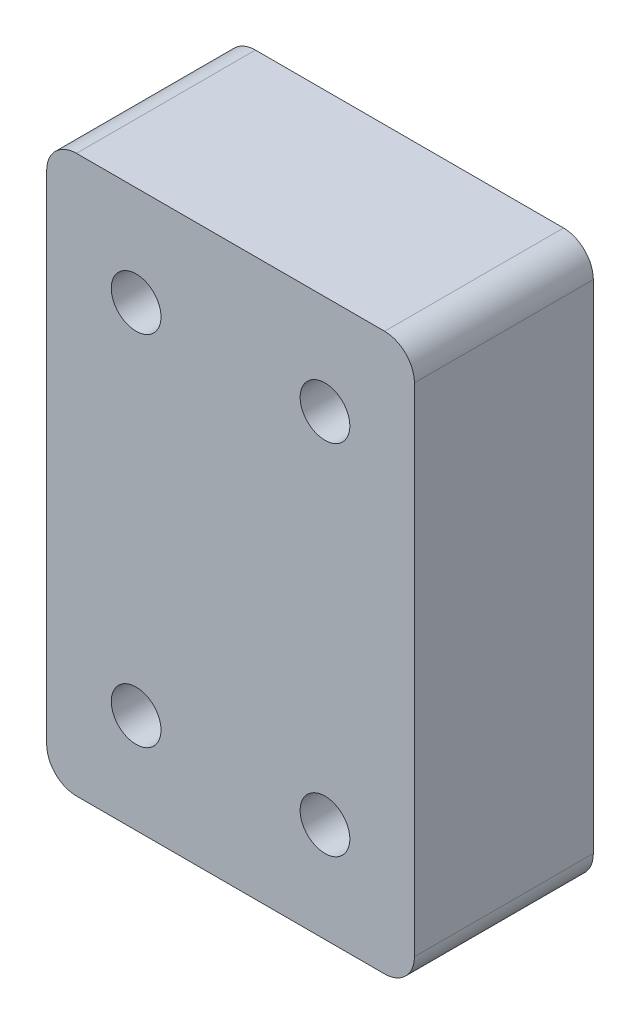
ISO-10303-21;
HEADER;
FILE_DESCRIPTION(('STEP AP214'),'2;1');
FILE_NAME('part.step','',(''),(''),'','','');
FILE_SCHEMA(('AUTOMOTIVE_DESIGN { 1 0 10303 214 1 1 1 1 }'));
ENDSEC;
DATA;
#1=APPLICATION_CONTEXT('core data for automotive mechanical design processes');
#2=APPLICATION_PROTOCOL_DEFINITION('international standard','automotive_design',2000,#1);
#3=PRODUCT_CONTEXT('',#1,'mechanical');
#4=PRODUCT('Part','Part','',(#3));
#5=PRODUCT_RELATED_PRODUCT_CATEGORY('part','',(#4));
#6=PRODUCT_DEFINITION_FORMATION('','',#4);
#7=PRODUCT_DEFINITION_CONTEXT('part definition',#1,'design');
#8=PRODUCT_DEFINITION('design','',#6,#7);
#9=PRODUCT_DEFINITION_SHAPE('','',#8);
#10=(LENGTH_UNIT() NAMED_UNIT(*) SI_UNIT(.MILLI.,.METRE.));
#11=(NAMED_UNIT(*) PLANE_ANGLE_UNIT() SI_UNIT($,.RADIAN.));
#12=(NAMED_UNIT(*) SI_UNIT($,.STERADIAN.) SOLID_ANGLE_UNIT());
#13=UNCERTAINTY_MEASURE_WITH_UNIT(LENGTH_MEASURE(1.E-05),#10,'distance_accuracy_value','');
#14=(GEOMETRIC_REPRESENTATION_CONTEXT(3) GLOBAL_UNCERTAINTY_ASSIGNED_CONTEXT((#13)) GLOBAL_UNIT_ASSIGNED_CONTEXT((#10,
#11,#12)) REPRESENTATION_CONTEXT('',''));
#15=CARTESIAN_POINT('',(0.,0.,0.));
#16=DIRECTION('',(0.,0.,1.));
#17=DIRECTION('',(1.,0.,0.));
#18=AXIS2_PLACEMENT_3D('',#15,#16,#17);
#19=CARTESIAN_POINT('',(-15.5,-25.,18.));
#20=DIRECTION('',(0.,0.,-1.));
#21=DIRECTION('',(-1.,0.,0.));
#22=AXIS2_PLACEMENT_3D('',#19,#20,#21);
#23=CYLINDRICAL_SURFACE('',#22,3.);
#24=CARTESIAN_POINT('',(-15.5,-25.,0.));
#25=DIRECTION('',(0.,0.,1.));
#26=DIRECTION('',(-1.,0.,0.));
#27=AXIS2_PLACEMENT_3D('',#24,#25,#26);
#28=CIRCLE('',#27,3.);
#29=CARTESIAN_POINT('',(-18.5,-25.,0.));
#30=VERTEX_POINT('',#29);
#31=CARTESIAN_POINT('',(-15.5,-28.,0.));
#32=VERTEX_POINT('',#31);
#33=EDGE_CURVE('E140',#30,#32,#28,.T.);
#34=ORIENTED_EDGE('',*,*,#33,.T.);
#35=DIRECTION('',(0.,0.,-1.));
#36=VECTOR('',#35,1.);
#37=CARTESIAN_POINT('',(-15.5,-28.,18.));
#38=LINE('',#37,#36);
#39=CARTESIAN_POINT('',(-15.5,-28.,18.));
#40=VERTEX_POINT('',#39);
#41=EDGE_CURVE('E11',#40,#32,#38,.T.);
#42=ORIENTED_EDGE('',*,*,#41,.F.);
#43=CARTESIAN_POINT('',(-15.5,-25.,18.));
#44=DIRECTION('',(0.,0.,1.));
#45=DIRECTION('',(-1.,0.,0.));
#46=AXIS2_PLACEMENT_3D('',#43,#44,#45);
#47=CIRCLE('',#46,3.);
#48=CARTESIAN_POINT('',(-18.5,-25.,18.));
#49=VERTEX_POINT('',#48);
#50=EDGE_CURVE('E163',#49,#40,#47,.T.);
#51=ORIENTED_EDGE('',*,*,#50,.F.);
#52=DIRECTION('',(0.,0.,-1.));
#53=VECTOR('',#52,1.);
#54=CARTESIAN_POINT('',(-18.5,-25.,18.));
#55=LINE('',#54,#53);
#56=EDGE_CURVE('E136',#49,#30,#55,.T.);
#57=ORIENTED_EDGE('',*,*,#56,.T.);
#58=EDGE_LOOP('',(#34,#42,#51,#57));
#59=FACE_BOUND('',#58,.T.);
#60=ADVANCED_FACE('F39',(#59),#23,.T.);
#61=CARTESIAN_POINT('',(-15.5,-28.,18.));
#62=DIRECTION('',(0.,1.,0.));
#63=DIRECTION('',(0.,0.,1.));
#64=AXIS2_PLACEMENT_3D('',#61,#62,#63);
#65=PLANE('',#64);
#66=DIRECTION('',(1.,0.,0.));
#67=VECTOR('',#66,1.);
#68=CARTESIAN_POINT('',(-15.5,-28.,0.));
#69=LINE('',#68,#67);
#70=CARTESIAN_POINT('',(15.5,-28.,0.));
#71=VERTEX_POINT('',#70);
#72=EDGE_CURVE('E144',#32,#71,#69,.T.);
#73=ORIENTED_EDGE('',*,*,#72,.T.);
#74=DIRECTION('',(0.,0.,-1.));
#75=VECTOR('',#74,1.);
#76=CARTESIAN_POINT('',(15.5,-28.,18.));
#77=LINE('',#76,#75);
#78=CARTESIAN_POINT('',(15.5,-28.,18.));
#79=VERTEX_POINT('',#78);
#80=EDGE_CURVE('E48',#79,#71,#77,.T.);
#81=ORIENTED_EDGE('',*,*,#80,.F.);
#82=DIRECTION('',(1.,0.,0.));
#83=VECTOR('',#82,1.);
#84=CARTESIAN_POINT('',(-15.5,-28.,18.));
#85=LINE('',#84,#83);
#86=EDGE_CURVE('E99',#40,#79,#85,.T.);
#87=ORIENTED_EDGE('',*,*,#86,.F.);
#88=ORIENTED_EDGE('',*,*,#41,.T.);
#89=EDGE_LOOP('',(#73,#81,#87,#88));
#90=FACE_BOUND('',#89,.T.);
#91=ADVANCED_FACE('F268',(#90),#65,.F.);
#92=CARTESIAN_POINT('',(15.5,-25.,18.));
#93=DIRECTION('',(0.,0.,-1.));
#94=DIRECTION('',(-1.,0.,0.));
#95=AXIS2_PLACEMENT_3D('',#92,#93,#94);
#96=CYLINDRICAL_SURFACE('',#95,3.);
#97=CARTESIAN_POINT('',(15.5,-25.,0.));
#98=DIRECTION('',(0.,0.,1.));
#99=DIRECTION('',(1.,0.,0.));
#100=AXIS2_PLACEMENT_3D('',#97,#98,#99);
#101=CIRCLE('',#100,3.);
#102=CARTESIAN_POINT('',(18.5,-25.,0.));
#103=VERTEX_POINT('',#102);
#104=EDGE_CURVE('E148',#71,#103,#101,.T.);
#105=ORIENTED_EDGE('',*,*,#104,.T.);
#106=DIRECTION('',(0.,0.,-1.));
#107=VECTOR('',#106,1.);
#108=CARTESIAN_POINT('',(18.5,-25.,18.));
#109=LINE('',#108,#107);
#110=CARTESIAN_POINT('',(18.5,-25.,18.));
#111=VERTEX_POINT('',#110);
#112=EDGE_CURVE('E174',#111,#103,#109,.T.);
#113=ORIENTED_EDGE('',*,*,#112,.F.);
#114=CARTESIAN_POINT('',(15.5,-25.,18.));
#115=DIRECTION('',(0.,0.,1.));
#116=DIRECTION('',(1.,0.,0.));
#117=AXIS2_PLACEMENT_3D('',#114,#115,#116);
#118=CIRCLE('',#117,3.);
#119=EDGE_CURVE('E184',#79,#111,#118,.T.);
#120=ORIENTED_EDGE('',*,*,#119,.F.);
#121=ORIENTED_EDGE('',*,*,#80,.T.);
#122=EDGE_LOOP('',(#105,#113,#120,#121));
#123=FACE_BOUND('',#122,.T.);
#124=ADVANCED_FACE('F182',(#123),#96,.T.);
#125=CARTESIAN_POINT('',(18.5,-25.,18.));
#126=DIRECTION('',(-1.,0.,0.));
#127=DIRECTION('',(0.,0.,1.));
#128=AXIS2_PLACEMENT_3D('',#125,#126,#127);
#129=PLANE('',#128);
#130=DIRECTION('',(0.,1.,0.));
#131=VECTOR('',#130,1.);
#132=CARTESIAN_POINT('',(18.5,-25.,0.));
#133=LINE('',#132,#131);
#134=CARTESIAN_POINT('',(18.5,25.,0.));
#135=VERTEX_POINT('',#134);
#136=EDGE_CURVE('E151',#103,#135,#133,.T.);
#137=ORIENTED_EDGE('',*,*,#136,.T.);
#138=DIRECTION('',(0.,0.,-1.));
#139=VECTOR('',#138,1.);
#140=CARTESIAN_POINT('',(18.5,25.,18.));
#141=LINE('',#140,#139);
#142=CARTESIAN_POINT('',(18.5,25.,18.));
#143=VERTEX_POINT('',#142);
#144=EDGE_CURVE('E170',#143,#135,#141,.T.);
#145=ORIENTED_EDGE('',*,*,#144,.F.);
#146=DIRECTION('',(0.,1.,0.));
#147=VECTOR('',#146,1.);
#148=CARTESIAN_POINT('',(18.5,-25.,18.));
#149=LINE('',#148,#147);
#150=EDGE_CURVE('E197',#111,#143,#149,.T.);
#151=ORIENTED_EDGE('',*,*,#150,.F.);
#152=ORIENTED_EDGE('',*,*,#112,.T.);
#153=EDGE_LOOP('',(#137,#145,#151,#152));
#154=FACE_BOUND('',#153,.T.);
#155=ADVANCED_FACE('F192',(#154),#129,.F.);
#156=CARTESIAN_POINT('',(15.5,25.,18.));
#157=DIRECTION('',(0.,0.,-1.));
#158=DIRECTION('',(-1.,0.,0.));
#159=AXIS2_PLACEMENT_3D('',#156,#157,#158);
#160=CYLINDRICAL_SURFACE('',#159,3.);
#161=CARTESIAN_POINT('',(15.5,25.,0.));
#162=DIRECTION('',(0.,0.,1.));
#163=DIRECTION('',(-1.,0.,0.));
#164=AXIS2_PLACEMENT_3D('',#161,#162,#163);
#165=CIRCLE('',#164,3.);
#166=CARTESIAN_POINT('',(15.5,28.,0.));
#167=VERTEX_POINT('',#166);
#168=EDGE_CURVE('E154',#135,#167,#165,.T.);
#169=ORIENTED_EDGE('',*,*,#168,.T.);
#170=DIRECTION('',(0.,0.,-1.));
#171=VECTOR('',#170,1.);
#172=CARTESIAN_POINT('',(15.5,28.,18.));
#173=LINE('',#172,#171);
#174=CARTESIAN_POINT('',(15.5,28.,18.));
#175=VERTEX_POINT('',#174);
#176=EDGE_CURVE('E129',#175,#167,#173,.T.);
#177=ORIENTED_EDGE('',*,*,#176,.F.);
#178=CARTESIAN_POINT('',(15.5,25.,18.));
#179=DIRECTION('',(0.,0.,1.));
#180=DIRECTION('',(-1.,0.,0.));
#181=AXIS2_PLACEMENT_3D('',#178,#179,#180);
#182=CIRCLE('',#181,3.);
#183=EDGE_CURVE('E118',#143,#175,#182,.T.);
#184=ORIENTED_EDGE('',*,*,#183,.F.);
#185=ORIENTED_EDGE('',*,*,#144,.T.);
#186=EDGE_LOOP('',(#169,#177,#184,#185));
#187=FACE_BOUND('',#186,.T.);
#188=ADVANCED_FACE('F195',(#187),#160,.T.);
#189=CARTESIAN_POINT('',(-15.5,28.,18.));
#190=DIRECTION('',(0.,-1.,0.));
#191=DIRECTION('',(0.,0.,-1.));
#192=AXIS2_PLACEMENT_3D('',#189,#190,#191);
#193=PLANE('',#192);
#194=DIRECTION('',(-1.,0.,0.));
#195=VECTOR('',#194,1.);
#196=CARTESIAN_POINT('',(-15.5,28.,0.));
#197=LINE('',#196,#195);
#198=CARTESIAN_POINT('',(-15.5,28.,0.));
#199=VERTEX_POINT('',#198);
#200=EDGE_CURVE('E127',#167,#199,#197,.T.);
#201=ORIENTED_EDGE('',*,*,#200,.T.);
#202=DIRECTION('',(0.,0.,-1.));
#203=VECTOR('',#202,1.);
#204=CARTESIAN_POINT('',(-15.5,28.,18.));
#205=LINE('',#204,#203);
#206=CARTESIAN_POINT('',(-15.5,28.,18.));
#207=VERTEX_POINT('',#206);
#208=EDGE_CURVE('E124',#207,#199,#205,.T.);
#209=ORIENTED_EDGE('',*,*,#208,.F.);
#210=DIRECTION('',(-1.,0.,0.));
#211=VECTOR('',#210,1.);
#212=CARTESIAN_POINT('',(-15.5,28.,18.));
#213=LINE('',#212,#211);
#214=EDGE_CURVE('E112',#175,#207,#213,.T.);
#215=ORIENTED_EDGE('',*,*,#214,.F.);
#216=ORIENTED_EDGE('',*,*,#176,.T.);
#217=EDGE_LOOP('',(#201,#209,#215,#216));
#218=FACE_BOUND('',#217,.T.);
#219=ADVANCED_FACE('F125',(#218),#193,.F.);
#220=CARTESIAN_POINT('',(-15.5,25.,18.));
#221=DIRECTION('',(0.,0.,-1.));
#222=DIRECTION('',(-1.,0.,0.));
#223=AXIS2_PLACEMENT_3D('',#220,#221,#222);
#224=CYLINDRICAL_SURFACE('',#223,3.);
#225=CARTESIAN_POINT('',(-15.5,25.,0.));
#226=DIRECTION('',(0.,0.,1.));
#227=DIRECTION('',(-1.,0.,0.));
#228=AXIS2_PLACEMENT_3D('',#225,#226,#227);
#229=CIRCLE('',#228,3.);
#230=CARTESIAN_POINT('',(-18.5,25.,0.));
#231=VERTEX_POINT('',#230);
#232=EDGE_CURVE('E85',#199,#231,#229,.T.);
#233=ORIENTED_EDGE('',*,*,#232,.T.);
#234=DIRECTION('',(0.,0.,-1.));
#235=VECTOR('',#234,1.);
#236=CARTESIAN_POINT('',(-18.5,25.,18.));
#237=LINE('',#236,#235);
#238=CARTESIAN_POINT('',(-18.5,25.,18.));
#239=VERTEX_POINT('',#238);
#240=EDGE_CURVE('E130',#239,#231,#237,.T.);
#241=ORIENTED_EDGE('',*,*,#240,.F.);
#242=CARTESIAN_POINT('',(-15.5,25.,18.));
#243=DIRECTION('',(0.,0.,1.));
#244=DIRECTION('',(-1.,0.,0.));
#245=AXIS2_PLACEMENT_3D('',#242,#243,#244);
#246=CIRCLE('',#245,3.);
#247=EDGE_CURVE('E116',#207,#239,#246,.T.);
#248=ORIENTED_EDGE('',*,*,#247,.F.);
#249=ORIENTED_EDGE('',*,*,#208,.T.);
#250=EDGE_LOOP('',(#233,#241,#248,#249));
#251=FACE_BOUND('',#250,.T.);
#252=ADVANCED_FACE('F132',(#251),#224,.T.);
#253=CARTESIAN_POINT('',(-18.5,-25.,18.));
#254=DIRECTION('',(1.,0.,0.));
#255=DIRECTION('',(0.,0.,-1.));
#256=AXIS2_PLACEMENT_3D('',#253,#254,#255);
#257=PLANE('',#256);
#258=DIRECTION('',(0.,-1.,0.));
#259=VECTOR('',#258,1.);
#260=CARTESIAN_POINT('',(-18.5,-25.,0.));
#261=LINE('',#260,#259);
#262=EDGE_CURVE('E91',#231,#30,#261,.T.);
#263=ORIENTED_EDGE('',*,*,#262,.T.);
#264=ORIENTED_EDGE('',*,*,#56,.F.);
#265=DIRECTION('',(0.,-1.,0.));
#266=VECTOR('',#265,1.);
#267=CARTESIAN_POINT('',(-18.5,-25.,18.));
#268=LINE('',#267,#266);
#269=EDGE_CURVE('E56',#239,#49,#268,.T.);
#270=ORIENTED_EDGE('',*,*,#269,.F.);
#271=ORIENTED_EDGE('',*,*,#240,.T.);
#272=EDGE_LOOP('',(#263,#264,#270,#271));
#273=FACE_BOUND('',#272,.T.);
#274=ADVANCED_FACE('F250',(#273),#257,.F.);
#275=CARTESIAN_POINT('',(-15.5,-25.,18.));
#276=DIRECTION('',(0.,0.,-1.));
#277=DIRECTION('',(-1.,0.,0.));
#278=AXIS2_PLACEMENT_3D('',#275,#276,#277);
#279=PLANE('',#278);
#280=CARTESIAN_POINT('',(9.50000000000001,18.,18.));
#281=DIRECTION('',(0.,0.,1.));
#282=DIRECTION('',(-1.,0.,0.));
#283=AXIS2_PLACEMENT_3D('',#280,#281,#282);
#284=CIRCLE('',#283,2.5);
#285=CARTESIAN_POINT('',(7.00000000000001,18.,18.));
#286=VERTEX_POINT('',#285);
#287=EDGE_CURVE('E215',#286,#286,#284,.T.);
#288=ORIENTED_EDGE('',*,*,#287,.F.);
#289=EDGE_LOOP('',(#288));
#290=FACE_BOUND('',#289,.T.);
#291=CARTESIAN_POINT('',(9.50000000000002,-18.,18.));
#292=DIRECTION('',(0.,0.,1.));
#293=DIRECTION('',(-1.,0.,0.));
#294=AXIS2_PLACEMENT_3D('',#291,#292,#293);
#295=CIRCLE('',#294,2.5);
#296=CARTESIAN_POINT('',(7.00000000000002,-18.,18.));
#297=VERTEX_POINT('',#296);
#298=EDGE_CURVE('E223',#297,#297,#295,.T.);
#299=ORIENTED_EDGE('',*,*,#298,.F.);
#300=EDGE_LOOP('',(#299));
#301=FACE_BOUND('',#300,.T.);
#302=CARTESIAN_POINT('',(-9.50000000000001,-18.,18.));
#303=DIRECTION('',(0.,0.,1.));
#304=DIRECTION('',(1.,0.,0.));
#305=AXIS2_PLACEMENT_3D('',#302,#303,#304);
#306=CIRCLE('',#305,2.5);
#307=CARTESIAN_POINT('',(-7.00000000000001,-18.,18.));
#308=VERTEX_POINT('',#307);
#309=EDGE_CURVE('E231',#308,#308,#306,.T.);
#310=ORIENTED_EDGE('',*,*,#309,.F.);
#311=EDGE_LOOP('',(#310));
#312=FACE_BOUND('',#311,.T.);
#313=CARTESIAN_POINT('',(-9.50000000000001,18.,18.));
#314=DIRECTION('',(0.,0.,1.));
#315=DIRECTION('',(1.,0.,0.));
#316=AXIS2_PLACEMENT_3D('',#313,#314,#315);
#317=CIRCLE('',#316,2.5);
#318=CARTESIAN_POINT('',(-7.00000000000001,18.,18.));
#319=VERTEX_POINT('',#318);
#320=EDGE_CURVE('E207',#319,#319,#317,.T.);
#321=ORIENTED_EDGE('',*,*,#320,.F.);
#322=EDGE_LOOP('',(#321));
#323=FACE_BOUND('',#322,.T.);
#324=ORIENTED_EDGE('',*,*,#50,.T.);
#325=ORIENTED_EDGE('',*,*,#86,.T.);
#326=ORIENTED_EDGE('',*,*,#119,.T.);
#327=ORIENTED_EDGE('',*,*,#150,.T.);
#328=ORIENTED_EDGE('',*,*,#183,.T.);
#329=ORIENTED_EDGE('',*,*,#214,.T.);
#330=ORIENTED_EDGE('',*,*,#247,.T.);
#331=ORIENTED_EDGE('',*,*,#269,.T.);
#332=EDGE_LOOP('',(#324,#325,#326,#327,#328,#329,#330,#331));
#333=FACE_BOUND('',#332,.T.);
#334=ADVANCED_FACE('F114',(#290,#301,#312,#323,#333),#279,.F.);
#335=CARTESIAN_POINT('',(-15.5,-25.,0.));
#336=DIRECTION('',(0.,0.,-1.));
#337=DIRECTION('',(-1.,0.,0.));
#338=AXIS2_PLACEMENT_3D('',#335,#336,#337);
#339=PLANE('',#338);
#340=ORIENTED_EDGE('',*,*,#33,.F.);
#341=ORIENTED_EDGE('',*,*,#262,.F.);
#342=ORIENTED_EDGE('',*,*,#232,.F.);
#343=ORIENTED_EDGE('',*,*,#200,.F.);
#344=ORIENTED_EDGE('',*,*,#168,.F.);
#345=ORIENTED_EDGE('',*,*,#136,.F.);
#346=ORIENTED_EDGE('',*,*,#104,.F.);
#347=ORIENTED_EDGE('',*,*,#72,.F.);
#348=EDGE_LOOP('',(#340,#341,#342,#343,#344,#345,#346,#347));
#349=FACE_BOUND('',#348,.T.);
#350=ADVANCED_FACE('F188',(#349),#339,.T.);
#351=CARTESIAN_POINT('',(-9.50000000000001,18.,14.));
#352=DIRECTION('',(0.,0.,1.));
#353=DIRECTION('',(1.,0.,0.));
#354=AXIS2_PLACEMENT_3D('',#351,#352,#353);
#355=CYLINDRICAL_SURFACE('',#354,2.5);
#356=CARTESIAN_POINT('',(-9.50000000000001,18.,14.));
#357=DIRECTION('',(0.,0.,1.));
#358=DIRECTION('',(1.,0.,0.));
#359=AXIS2_PLACEMENT_3D('',#356,#357,#358);
#360=CIRCLE('',#359,2.5);
#361=CARTESIAN_POINT('',(-7.00000000000001,18.,14.));
#362=VERTEX_POINT('',#361);
#363=EDGE_CURVE('E145',#362,#362,#360,.T.);
#364=ORIENTED_EDGE('',*,*,#363,.F.);
#365=EDGE_LOOP('',(#364));
#366=FACE_BOUND('',#365,.T.);
#367=ORIENTED_EDGE('',*,*,#320,.T.);
#368=EDGE_LOOP('',(#367));
#369=FACE_BOUND('',#368,.T.);
#370=ADVANCED_FACE('F255',(#366,#369),#355,.F.);
#371=CARTESIAN_POINT('',(-9.50000000000001,18.,14.));
#372=DIRECTION('',(0.,0.,1.));
#373=DIRECTION('',(1.,0.,0.));
#374=AXIS2_PLACEMENT_3D('',#371,#372,#373);
#375=PLANE('',#374);
#376=ORIENTED_EDGE('',*,*,#363,.T.);
#377=EDGE_LOOP('',(#376));
#378=FACE_BOUND('',#377,.T.);
#379=ADVANCED_FACE('F244',(#378),#375,.T.);
#380=CARTESIAN_POINT('',(-9.50000000000001,-18.,14.));
#381=DIRECTION('',(0.,0.,1.));
#382=DIRECTION('',(1.,0.,0.));
#383=AXIS2_PLACEMENT_3D('',#380,#381,#382);
#384=CYLINDRICAL_SURFACE('',#383,2.5);
#385=CARTESIAN_POINT('',(-9.50000000000001,-18.,14.));
#386=DIRECTION('',(0.,0.,1.));
#387=DIRECTION('',(1.,0.,0.));
#388=AXIS2_PLACEMENT_3D('',#385,#386,#387);
#389=CIRCLE('',#388,2.5);
#390=CARTESIAN_POINT('',(-7.00000000000001,-18.,14.));
#391=VERTEX_POINT('',#390);
#392=EDGE_CURVE('E211',#391,#391,#389,.T.);
#393=ORIENTED_EDGE('',*,*,#392,.F.);
#394=EDGE_LOOP('',(#393));
#395=FACE_BOUND('',#394,.T.);
#396=ORIENTED_EDGE('',*,*,#309,.T.);
#397=EDGE_LOOP('',(#396));
#398=FACE_BOUND('',#397,.T.);
#399=ADVANCED_FACE('F241',(#395,#398),#384,.F.);
#400=CARTESIAN_POINT('',(-9.50000000000001,-18.,14.));
#401=DIRECTION('',(0.,0.,1.));
#402=DIRECTION('',(1.,0.,0.));
#403=AXIS2_PLACEMENT_3D('',#400,#401,#402);
#404=PLANE('',#403);
#405=ORIENTED_EDGE('',*,*,#392,.T.);
#406=EDGE_LOOP('',(#405));
#407=FACE_BOUND('',#406,.T.);
#408=ADVANCED_FACE('F239',(#407),#404,.T.);
#409=CARTESIAN_POINT('',(9.50000000000002,-18.,14.));
#410=DIRECTION('',(0.,0.,1.));
#411=DIRECTION('',(1.,0.,0.));
#412=AXIS2_PLACEMENT_3D('',#409,#410,#411);
#413=CYLINDRICAL_SURFACE('',#412,2.5);
#414=CARTESIAN_POINT('',(9.50000000000002,-18.,14.));
#415=DIRECTION('',(0.,0.,1.));
#416=DIRECTION('',(-1.,0.,0.));
#417=AXIS2_PLACEMENT_3D('',#414,#415,#416);
#418=CIRCLE('',#417,2.5);
#419=CARTESIAN_POINT('',(7.00000000000002,-18.,14.));
#420=VERTEX_POINT('',#419);
#421=EDGE_CURVE('E227',#420,#420,#418,.T.);
#422=ORIENTED_EDGE('',*,*,#421,.F.);
#423=EDGE_LOOP('',(#422));
#424=FACE_BOUND('',#423,.T.);
#425=ORIENTED_EDGE('',*,*,#298,.T.);
#426=EDGE_LOOP('',(#425));
#427=FACE_BOUND('',#426,.T.);
#428=ADVANCED_FACE('F350',(#424,#427),#413,.F.);
#429=CARTESIAN_POINT('',(9.50000000000002,-18.,14.));
#430=DIRECTION('',(0.,0.,-1.));
#431=DIRECTION('',(-1.,0.,0.));
#432=AXIS2_PLACEMENT_3D('',#429,#430,#431);
#433=PLANE('',#432);
#434=ORIENTED_EDGE('',*,*,#421,.T.);
#435=EDGE_LOOP('',(#434));
#436=FACE_BOUND('',#435,.T.);
#437=ADVANCED_FACE('F359',(#436),#433,.F.);
#438=CARTESIAN_POINT('',(9.50000000000001,18.,14.));
#439=DIRECTION('',(0.,0.,1.));
#440=DIRECTION('',(1.,0.,0.));
#441=AXIS2_PLACEMENT_3D('',#438,#439,#440);
#442=CYLINDRICAL_SURFACE('',#441,2.5);
#443=CARTESIAN_POINT('',(9.50000000000001,18.,14.));
#444=DIRECTION('',(0.,0.,1.));
#445=DIRECTION('',(-1.,0.,0.));
#446=AXIS2_PLACEMENT_3D('',#443,#444,#445);
#447=CIRCLE('',#446,2.5);
#448=CARTESIAN_POINT('',(7.00000000000001,18.,14.));
#449=VERTEX_POINT('',#448);
#450=EDGE_CURVE('E219',#449,#449,#447,.T.);
#451=ORIENTED_EDGE('',*,*,#450,.F.);
#452=EDGE_LOOP('',(#451));
#453=FACE_BOUND('',#452,.T.);
#454=ORIENTED_EDGE('',*,*,#287,.T.);
#455=EDGE_LOOP('',(#454));
#456=FACE_BOUND('',#455,.T.);
#457=ADVANCED_FACE('F369',(#453,#456),#442,.F.);
#458=CARTESIAN_POINT('',(9.50000000000001,18.,14.));
#459=DIRECTION('',(0.,0.,-1.));
#460=DIRECTION('',(-1.,0.,0.));
#461=AXIS2_PLACEMENT_3D('',#458,#459,#460);
#462=PLANE('',#461);
#463=ORIENTED_EDGE('',*,*,#450,.T.);
#464=EDGE_LOOP('',(#463));
#465=FACE_BOUND('',#464,.T.);
#466=ADVANCED_FACE('F379',(#465),#462,.F.);
#467=CLOSED_SHELL('',(#60,#91,#124,#155,#188,#219,#252,#274,#334,#350,#370,#379,#399,#408,#428,
#437,#457,#466));
#468=MANIFOLD_SOLID_BREP('B2',#467);
#469=ADVANCED_BREP_SHAPE_REPRESENTATION('',(#18,#468),#14);
#470=SHAPE_DEFINITION_REPRESENTATION(#9,#469);
ENDSEC;
END-ISO-10303-21;
